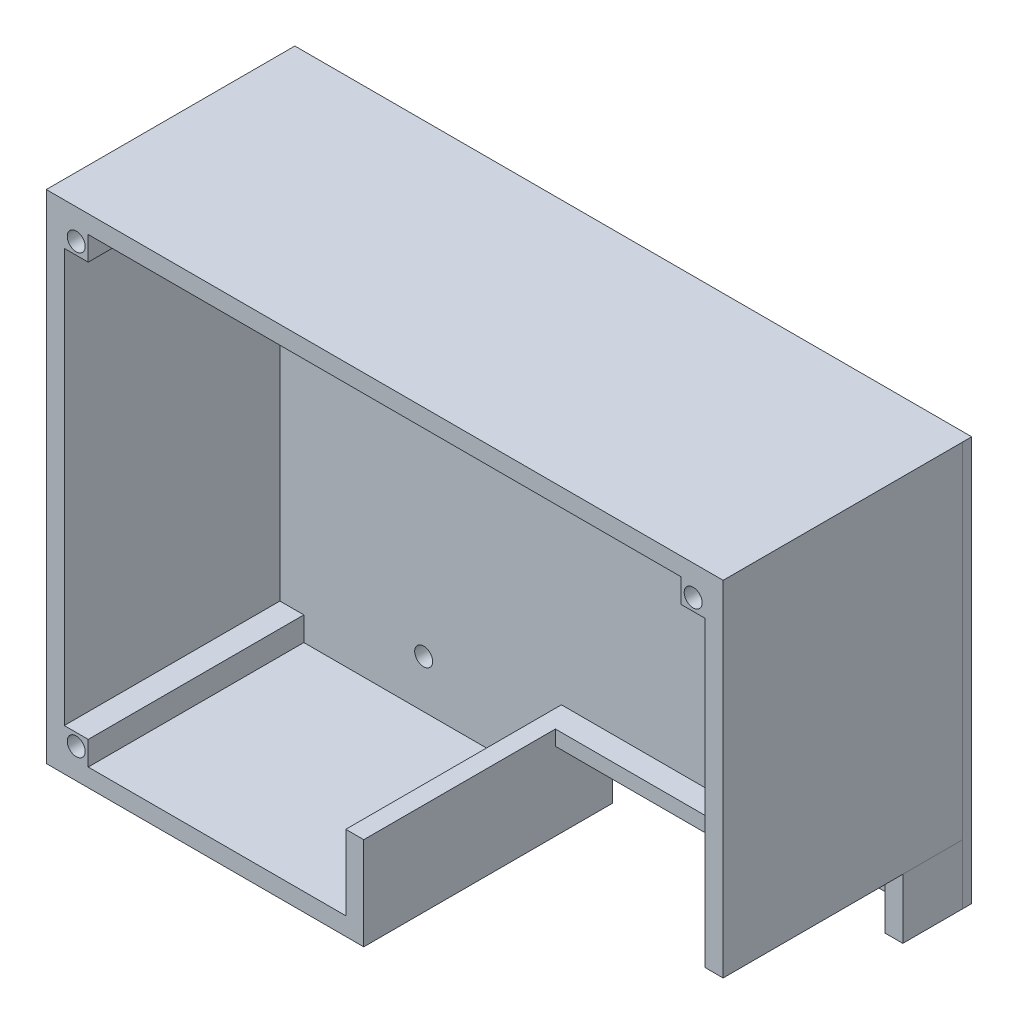
ISO-10303-21;
HEADER;
FILE_DESCRIPTION(('STEP AP214'),'2;1');
FILE_NAME('part.step','',(''),(''),'','','');
FILE_SCHEMA(('AUTOMOTIVE_DESIGN { 1 0 10303 214 1 1 1 1 }'));
ENDSEC;
DATA;
#1=APPLICATION_CONTEXT('core data for automotive mechanical design processes');
#2=APPLICATION_PROTOCOL_DEFINITION('international standard','automotive_design',2000,#1);
#3=PRODUCT_CONTEXT('',#1,'mechanical');
#4=PRODUCT('Part','Part','',(#3));
#5=PRODUCT_RELATED_PRODUCT_CATEGORY('part','',(#4));
#6=PRODUCT_DEFINITION_FORMATION('','',#4);
#7=PRODUCT_DEFINITION_CONTEXT('part definition',#1,'design');
#8=PRODUCT_DEFINITION('design','',#6,#7);
#9=PRODUCT_DEFINITION_SHAPE('','',#8);
#10=(LENGTH_UNIT() NAMED_UNIT(*) SI_UNIT(.MILLI.,.METRE.));
#11=(NAMED_UNIT(*) PLANE_ANGLE_UNIT() SI_UNIT($,.RADIAN.));
#12=(NAMED_UNIT(*) SI_UNIT($,.STERADIAN.) SOLID_ANGLE_UNIT());
#13=UNCERTAINTY_MEASURE_WITH_UNIT(LENGTH_MEASURE(1.E-05),#10,'distance_accuracy_value','');
#14=(GEOMETRIC_REPRESENTATION_CONTEXT(3) GLOBAL_UNCERTAINTY_ASSIGNED_CONTEXT((#13)) GLOBAL_UNIT_ASSIGNED_CONTEXT((#10,
#11,#12)) REPRESENTATION_CONTEXT('',''));
#15=CARTESIAN_POINT('',(0.,0.,0.));
#16=DIRECTION('',(0.,0.,1.));
#17=DIRECTION('',(1.,0.,0.));
#18=AXIS2_PLACEMENT_3D('',#15,#16,#17);
#19=CARTESIAN_POINT('',(27.,0.,4.));
#20=DIRECTION('',(0.,1.,0.));
#21=DIRECTION('',(-1.,0.,0.));
#22=AXIS2_PLACEMENT_3D('',#19,#20,#21);
#23=PLANE('',#22);
#24=DIRECTION('',(0.,0.,-1.));
#25=VECTOR('',#24,1.);
#26=CARTESIAN_POINT('',(85.6003249374755,0.,8.));
#27=LINE('',#26,#25);
#28=CARTESIAN_POINT('',(85.6003249374755,0.,4.));
#29=VERTEX_POINT('',#28);
#30=CARTESIAN_POINT('',(85.6003249374755,0.,-1.5));
#31=VERTEX_POINT('',#30);
#32=EDGE_CURVE('E323',#29,#31,#27,.T.);
#33=ORIENTED_EDGE('',*,*,#32,.T.);
#34=DIRECTION('',(-1.,0.,0.));
#35=VECTOR('',#34,1.);
#36=CARTESIAN_POINT('',(85.6003249374755,0.,-1.5));
#37=LINE('',#36,#35);
#38=CARTESIAN_POINT('',(107.994303538057,0.,-1.5));
#39=VERTEX_POINT('',#38);
#40=EDGE_CURVE('E236',#39,#31,#37,.T.);
#41=ORIENTED_EDGE('',*,*,#40,.F.);
#42=DIRECTION('',(0.,0.,1.));
#43=VECTOR('',#42,1.);
#44=CARTESIAN_POINT('',(107.994303538057,0.,-1.5));
#45=LINE('',#44,#43);
#46=CARTESIAN_POINT('',(107.994303538057,0.,0.));
#47=VERTEX_POINT('',#46);
#48=EDGE_CURVE('E248',#39,#47,#45,.T.);
#49=ORIENTED_EDGE('',*,*,#48,.T.);
#50=DIRECTION('',(0.,0.,-1.));
#51=VECTOR('',#50,1.);
#52=CARTESIAN_POINT('',(107.994303538057,0.,10.));
#53=LINE('',#52,#51);
#54=CARTESIAN_POINT('',(107.994303538057,0.,10.));
#55=VERTEX_POINT('',#54);
#56=EDGE_CURVE('E289',#55,#47,#53,.T.);
#57=ORIENTED_EDGE('',*,*,#56,.F.);
#58=DIRECTION('',(1.,0.,0.));
#59=VECTOR('',#58,1.);
#60=CARTESIAN_POINT('',(105.,0.,10.));
#61=LINE('',#60,#59);
#62=CARTESIAN_POINT('',(105.,0.,10.));
#63=VERTEX_POINT('',#62);
#64=EDGE_CURVE('E297',#63,#55,#61,.T.);
#65=ORIENTED_EDGE('',*,*,#64,.F.);
#66=DIRECTION('',(0.,0.,-1.));
#67=VECTOR('',#66,1.);
#68=CARTESIAN_POINT('',(105.,0.,10.));
#69=LINE('',#68,#67);
#70=CARTESIAN_POINT('',(105.,0.,4.));
#71=VERTEX_POINT('',#70);
#72=EDGE_CURVE('E296',#63,#71,#69,.T.);
#73=ORIENTED_EDGE('',*,*,#72,.T.);
#74=DIRECTION('',(1.,0.,0.));
#75=VECTOR('',#74,1.);
#76=CARTESIAN_POINT('',(27.,0.,4.));
#77=LINE('',#76,#75);
#78=EDGE_CURVE('E47',#29,#71,#77,.T.);
#79=ORIENTED_EDGE('',*,*,#78,.F.);
#80=EDGE_LOOP('',(#33,#41,#49,#57,#65,#73,#79));
#81=FACE_BOUND('',#80,.T.);
#82=ADVANCED_FACE('F39',(#81),#23,.F.);
#83=CARTESIAN_POINT('',(48.,-15.5,180.206989840022));
#84=DIRECTION('',(-1.,0.,0.));
#85=DIRECTION('',(0.,0.,1.));
#86=AXIS2_PLACEMENT_3D('',#83,#84,#85);
#87=PLANE('',#86);
#88=DIRECTION('',(0.,0.,-1.));
#89=VECTOR('',#88,1.);
#90=CARTESIAN_POINT('',(48.,-2.49999999999999,8.));
#91=LINE('',#90,#89);
#92=CARTESIAN_POINT('',(48.,-2.5,8.00000000000001));
#93=VERTEX_POINT('',#92);
#94=CARTESIAN_POINT('',(48.,-2.5,-1.5));
#95=VERTEX_POINT('',#94);
#96=EDGE_CURVE('E61',#93,#95,#91,.T.);
#97=ORIENTED_EDGE('',*,*,#96,.F.);
#98=DIRECTION('',(0.,-1.,0.));
#99=VECTOR('',#98,1.);
#100=CARTESIAN_POINT('',(48.,0.,8.));
#101=LINE('',#100,#99);
#102=CARTESIAN_POINT('',(48.,0.,8.00000000000001));
#103=VERTEX_POINT('',#102);
#104=EDGE_CURVE('E316',#103,#93,#101,.T.);
#105=ORIENTED_EDGE('',*,*,#104,.F.);
#106=DIRECTION('',(0.,0.,-1.));
#107=VECTOR('',#106,1.);
#108=CARTESIAN_POINT('',(48.,0.,180.206989840022));
#109=LINE('',#108,#107);
#110=CARTESIAN_POINT('',(48.,0.,40.));
#111=VERTEX_POINT('',#110);
#112=EDGE_CURVE('E341',#111,#103,#109,.T.);
#113=ORIENTED_EDGE('',*,*,#112,.F.);
#114=DIRECTION('',(0.,1.,0.));
#115=VECTOR('',#114,1.);
#116=CARTESIAN_POINT('',(48.,-15.5,40.));
#117=LINE('',#116,#115);
#118=CARTESIAN_POINT('',(48.,-15.5,40.));
#119=VERTEX_POINT('',#118);
#120=EDGE_CURVE('E328',#119,#111,#117,.T.);
#121=ORIENTED_EDGE('',*,*,#120,.F.);
#122=DIRECTION('',(0.,0.,-1.));
#123=VECTOR('',#122,1.);
#124=CARTESIAN_POINT('',(48.,-15.5,180.206989840022));
#125=LINE('',#124,#123);
#126=CARTESIAN_POINT('',(48.,-15.5,-1.5));
#127=VERTEX_POINT('',#126);
#128=EDGE_CURVE('E345',#119,#127,#125,.T.);
#129=ORIENTED_EDGE('',*,*,#128,.T.);
#130=DIRECTION('',(0.,-1.,0.));
#131=VECTOR('',#130,1.);
#132=CARTESIAN_POINT('',(48.,-15.5,-1.5));
#133=LINE('',#132,#131);
#134=EDGE_CURVE('E245',#95,#127,#133,.T.);
#135=ORIENTED_EDGE('',*,*,#134,.F.);
#136=EDGE_LOOP('',(#97,#105,#113,#121,#129,#135));
#137=FACE_BOUND('',#136,.T.);
#138=ADVANCED_FACE('F550',(#137),#87,.F.);
#139=CARTESIAN_POINT('',(105.,10.,40.));
#140=DIRECTION('',(1.,0.,0.));
#141=DIRECTION('',(0.,0.,-1.));
#142=AXIS2_PLACEMENT_3D('',#139,#140,#141);
#143=PLANE('',#142);
#144=DIRECTION('',(0.,0.,-1.));
#145=VECTOR('',#144,1.);
#146=CARTESIAN_POINT('',(105.,60.5,45.6568542494926));
#147=LINE('',#146,#145);
#148=CARTESIAN_POINT('',(105.,60.5,40.));
#149=VERTEX_POINT('',#148);
#150=CARTESIAN_POINT('',(105.,60.5,4.));
#151=VERTEX_POINT('',#150);
#152=EDGE_CURVE('E418',#149,#151,#147,.T.);
#153=ORIENTED_EDGE('',*,*,#152,.T.);
#154=DIRECTION('',(0.,1.,0.));
#155=VECTOR('',#154,1.);
#156=CARTESIAN_POINT('',(105.,0.,4.));
#157=LINE('',#156,#155);
#158=EDGE_CURVE('E449',#71,#151,#157,.T.);
#159=ORIENTED_EDGE('',*,*,#158,.F.);
#160=ORIENTED_EDGE('',*,*,#72,.F.);
#161=DIRECTION('',(0.,-1.,0.));
#162=VECTOR('',#161,1.);
#163=CARTESIAN_POINT('',(105.,10.,10.));
#164=LINE('',#163,#162);
#165=CARTESIAN_POINT('',(105.,10.,10.));
#166=VERTEX_POINT('',#165);
#167=EDGE_CURVE('E303',#166,#63,#164,.T.);
#168=ORIENTED_EDGE('',*,*,#167,.F.);
#169=DIRECTION('',(0.,0.,-1.));
#170=VECTOR('',#169,1.);
#171=CARTESIAN_POINT('',(105.,10.,40.));
#172=LINE('',#171,#170);
#173=CARTESIAN_POINT('',(105.,10.,40.));
#174=VERTEX_POINT('',#173);
#175=EDGE_CURVE('E446',#174,#166,#172,.T.);
#176=ORIENTED_EDGE('',*,*,#175,.F.);
#177=DIRECTION('',(0.,-1.,0.));
#178=VECTOR('',#177,1.);
#179=CARTESIAN_POINT('',(105.,10.,40.));
#180=LINE('',#179,#178);
#181=EDGE_CURVE('E442',#149,#174,#180,.T.);
#182=ORIENTED_EDGE('',*,*,#181,.F.);
#183=EDGE_LOOP('',(#153,#159,#160,#168,#176,#182));
#184=FACE_BOUND('',#183,.T.);
#185=ADVANCED_FACE('F546',(#184),#143,.F.);
#186=CARTESIAN_POINT('',(-2.,-12.5,40.));
#187=DIRECTION('',(0.,-1.,0.));
#188=DIRECTION('',(1.,0.,0.));
#189=AXIS2_PLACEMENT_3D('',#186,#187,#188);
#190=PLANE('',#189);
#191=DIRECTION('',(0.,0.,-1.));
#192=VECTOR('',#191,1.);
#193=CARTESIAN_POINT('',(1.99999999999998,-12.5,45.6568542494926));
#194=LINE('',#193,#192);
#195=CARTESIAN_POINT('',(1.99999999999998,-12.5,40.));
#196=VERTEX_POINT('',#195);
#197=CARTESIAN_POINT('',(1.99999999999998,-12.5,4.));
#198=VERTEX_POINT('',#197);
#199=EDGE_CURVE('E378',#196,#198,#194,.T.);
#200=ORIENTED_EDGE('',*,*,#199,.F.);
#201=DIRECTION('',(-1.,0.,0.));
#202=VECTOR('',#201,1.);
#203=CARTESIAN_POINT('',(-2.,-12.5,40.));
#204=LINE('',#203,#202);
#205=CARTESIAN_POINT('',(45.,-12.5,40.));
#206=VERTEX_POINT('',#205);
#207=EDGE_CURVE('E385',#206,#196,#204,.T.);
#208=ORIENTED_EDGE('',*,*,#207,.F.);
#209=DIRECTION('',(0.,0.,-1.));
#210=VECTOR('',#209,1.);
#211=CARTESIAN_POINT('',(45.,-12.5,53.6473440639562));
#212=LINE('',#211,#210);
#213=CARTESIAN_POINT('',(45.,-12.5,4.));
#214=VERTEX_POINT('',#213);
#215=EDGE_CURVE('E331',#206,#214,#212,.T.);
#216=ORIENTED_EDGE('',*,*,#215,.T.);
#217=DIRECTION('',(1.,0.,0.));
#218=VECTOR('',#217,1.);
#219=CARTESIAN_POINT('',(-2.,-12.5,4.));
#220=LINE('',#219,#218);
#221=EDGE_CURVE('E457',#198,#214,#220,.T.);
#222=ORIENTED_EDGE('',*,*,#221,.F.);
#223=EDGE_LOOP('',(#200,#208,#216,#222));
#224=FACE_BOUND('',#223,.T.);
#225=ADVANCED_FACE('F549',(#224),#190,.F.);
#226=CARTESIAN_POINT('',(105.,64.5,40.));
#227=DIRECTION('',(0.,1.,0.));
#228=DIRECTION('',(-1.,0.,0.));
#229=AXIS2_PLACEMENT_3D('',#226,#227,#228);
#230=PLANE('',#229);
#231=DIRECTION('',(0.,0.,-1.));
#232=VECTOR('',#231,1.);
#233=CARTESIAN_POINT('',(2.,64.5,45.6568542494926));
#234=LINE('',#233,#232);
#235=CARTESIAN_POINT('',(2.,64.5,40.));
#236=VERTEX_POINT('',#235);
#237=CARTESIAN_POINT('',(2.,64.5,4.));
#238=VERTEX_POINT('',#237);
#239=EDGE_CURVE('E392',#236,#238,#234,.T.);
#240=ORIENTED_EDGE('',*,*,#239,.T.);
#241=DIRECTION('',(-1.,0.,0.));
#242=VECTOR('',#241,1.);
#243=CARTESIAN_POINT('',(105.,64.5,4.));
#244=LINE('',#243,#242);
#245=CARTESIAN_POINT('',(101.,64.5,4.));
#246=VERTEX_POINT('',#245);
#247=EDGE_CURVE('E451',#246,#238,#244,.T.);
#248=ORIENTED_EDGE('',*,*,#247,.F.);
#249=DIRECTION('',(0.,0.,-1.));
#250=VECTOR('',#249,1.);
#251=CARTESIAN_POINT('',(101.,64.5,45.6568542494926));
#252=LINE('',#251,#250);
#253=CARTESIAN_POINT('',(101.,64.5,40.));
#254=VERTEX_POINT('',#253);
#255=EDGE_CURVE('E363',#254,#246,#252,.T.);
#256=ORIENTED_EDGE('',*,*,#255,.F.);
#257=DIRECTION('',(1.,0.,0.));
#258=VECTOR('',#257,1.);
#259=CARTESIAN_POINT('',(105.,64.5,40.));
#260=LINE('',#259,#258);
#261=EDGE_CURVE('E439',#236,#254,#260,.T.);
#262=ORIENTED_EDGE('',*,*,#261,.F.);
#263=EDGE_LOOP('',(#240,#248,#256,#262));
#264=FACE_BOUND('',#263,.T.);
#265=ADVANCED_FACE('F552',(#264),#230,.F.);
#266=CARTESIAN_POINT('',(-2.,64.5,40.));
#267=DIRECTION('',(-1.,0.,0.));
#268=DIRECTION('',(0.,-1.,0.));
#269=AXIS2_PLACEMENT_3D('',#266,#267,#268);
#270=PLANE('',#269);
#271=DIRECTION('',(0.,0.,-1.));
#272=VECTOR('',#271,1.);
#273=CARTESIAN_POINT('',(-2.,-8.50000000000002,45.6568542494926));
#274=LINE('',#273,#272);
#275=CARTESIAN_POINT('',(-2.,-8.50000000000002,40.));
#276=VERTEX_POINT('',#275);
#277=CARTESIAN_POINT('',(-2.,-8.50000000000002,4.));
#278=VERTEX_POINT('',#277);
#279=EDGE_CURVE('E380',#276,#278,#274,.T.);
#280=ORIENTED_EDGE('',*,*,#279,.T.);
#281=DIRECTION('',(0.,-1.,0.));
#282=VECTOR('',#281,1.);
#283=CARTESIAN_POINT('',(-2.,64.5,4.));
#284=LINE('',#283,#282);
#285=CARTESIAN_POINT('',(-2.,60.5,4.));
#286=VERTEX_POINT('',#285);
#287=EDGE_CURVE('E454',#286,#278,#284,.T.);
#288=ORIENTED_EDGE('',*,*,#287,.F.);
#289=DIRECTION('',(0.,0.,-1.));
#290=VECTOR('',#289,1.);
#291=CARTESIAN_POINT('',(-2.,60.5,45.6568542494926));
#292=LINE('',#291,#290);
#293=CARTESIAN_POINT('',(-2.,60.5,40.));
#294=VERTEX_POINT('',#293);
#295=EDGE_CURVE('E395',#294,#286,#292,.T.);
#296=ORIENTED_EDGE('',*,*,#295,.F.);
#297=DIRECTION('',(0.,1.,0.));
#298=VECTOR('',#297,1.);
#299=CARTESIAN_POINT('',(-2.,64.5,40.));
#300=LINE('',#299,#298);
#301=EDGE_CURVE('E436',#276,#294,#300,.T.);
#302=ORIENTED_EDGE('',*,*,#301,.F.);
#303=EDGE_LOOP('',(#280,#288,#296,#302));
#304=FACE_BOUND('',#303,.T.);
#305=ADVANCED_FACE('F555',(#304),#270,.F.);
#306=CARTESIAN_POINT('',(22.,-4.5,4.));
#307=DIRECTION('',(0.,0.,-1.));
#308=DIRECTION('',(-1.,0.,0.));
#309=AXIS2_PLACEMENT_3D('',#306,#307,#308);
#310=PLANE('',#309);
#311=DIRECTION('',(0.,-1.,0.));
#312=VECTOR('',#311,1.);
#313=CARTESIAN_POINT('',(45.,-12.5,4.));
#314=LINE('',#313,#312);
#315=CARTESIAN_POINT('',(45.,0.,4.));
#316=VERTEX_POINT('',#315);
#317=EDGE_CURVE('E352',#316,#214,#314,.T.);
#318=ORIENTED_EDGE('',*,*,#317,.F.);
#319=EDGE_CURVE('E11',#316,#29,#77,.T.);
#320=ORIENTED_EDGE('',*,*,#319,.T.);
#321=ORIENTED_EDGE('',*,*,#78,.T.);
#322=ORIENTED_EDGE('',*,*,#158,.T.);
#323=DIRECTION('',(1.,0.,0.));
#324=VECTOR('',#323,1.);
#325=CARTESIAN_POINT('',(101.,60.5,4.));
#326=LINE('',#325,#324);
#327=CARTESIAN_POINT('',(101.,60.5,4.));
#328=VERTEX_POINT('',#327);
#329=EDGE_CURVE('E421',#328,#151,#326,.T.);
#330=ORIENTED_EDGE('',*,*,#329,.F.);
#331=DIRECTION('',(0.,-1.,0.));
#332=VECTOR('',#331,1.);
#333=CARTESIAN_POINT('',(101.,60.5,4.));
#334=LINE('',#333,#332);
#335=EDGE_CURVE('E424',#246,#328,#334,.T.);
#336=ORIENTED_EDGE('',*,*,#335,.F.);
#337=ORIENTED_EDGE('',*,*,#247,.T.);
#338=DIRECTION('',(0.,1.,0.));
#339=VECTOR('',#338,1.);
#340=CARTESIAN_POINT('',(2.,64.5,4.));
#341=LINE('',#340,#339);
#342=CARTESIAN_POINT('',(2.,60.5,4.));
#343=VERTEX_POINT('',#342);
#344=EDGE_CURVE('E403',#343,#238,#341,.T.);
#345=ORIENTED_EDGE('',*,*,#344,.F.);
#346=DIRECTION('',(1.,0.,0.));
#347=VECTOR('',#346,1.);
#348=CARTESIAN_POINT('',(-2.,60.5,4.));
#349=LINE('',#348,#347);
#350=EDGE_CURVE('E400',#286,#343,#349,.T.);
#351=ORIENTED_EDGE('',*,*,#350,.F.);
#352=ORIENTED_EDGE('',*,*,#287,.T.);
#353=DIRECTION('',(-1.,0.,0.));
#354=VECTOR('',#353,1.);
#355=CARTESIAN_POINT('',(-2.,-8.50000000000002,4.));
#356=LINE('',#355,#354);
#357=CARTESIAN_POINT('',(1.99999999999998,-8.50000000000002,4.));
#358=VERTEX_POINT('',#357);
#359=EDGE_CURVE('E376',#358,#278,#356,.T.);
#360=ORIENTED_EDGE('',*,*,#359,.F.);
#361=DIRECTION('',(0.,1.,0.));
#362=VECTOR('',#361,1.);
#363=CARTESIAN_POINT('',(1.99999999999998,-8.50000000000002,4.));
#364=LINE('',#363,#362);
#365=EDGE_CURVE('E373',#198,#358,#364,.T.);
#366=ORIENTED_EDGE('',*,*,#365,.F.);
#367=ORIENTED_EDGE('',*,*,#221,.T.);
#368=EDGE_LOOP('',(#318,#320,#321,#322,#330,#336,#337,#345,#351,#352,#360,#366,#367));
#369=FACE_BOUND('',#368,.T.);
#370=CARTESIAN_POINT('',(22.,-4.5,4.));
#371=DIRECTION('',(0.,0.,1.));
#372=DIRECTION('',(1.,0.,0.));
#373=AXIS2_PLACEMENT_3D('',#370,#371,#372);
#374=CIRCLE('',#373,1.5);
#375=CARTESIAN_POINT('',(23.5,-4.5,4.));
#376=VERTEX_POINT('',#375);
#377=EDGE_CURVE('E466',#376,#376,#374,.T.);
#378=ORIENTED_EDGE('',*,*,#377,.F.);
#379=EDGE_LOOP('',(#378));
#380=FACE_BOUND('',#379,.T.);
#381=CARTESIAN_POINT('',(22.,56.5,4.));
#382=DIRECTION('',(0.,0.,1.));
#383=DIRECTION('',(-1.,0.,0.));
#384=AXIS2_PLACEMENT_3D('',#381,#382,#383);
#385=CIRCLE('',#384,1.5);
#386=CARTESIAN_POINT('',(20.5,56.5,4.));
#387=VERTEX_POINT('',#386);
#388=EDGE_CURVE('E460',#387,#387,#385,.T.);
#389=ORIENTED_EDGE('',*,*,#388,.F.);
#390=EDGE_LOOP('',(#389));
#391=FACE_BOUND('',#390,.T.);
#392=ADVANCED_FACE('F559',(#369,#380,#391),#310,.F.);
#393=CARTESIAN_POINT('',(22.,-4.5,4.));
#394=DIRECTION('',(0.,0.,-1.));
#395=DIRECTION('',(-1.,0.,0.));
#396=AXIS2_PLACEMENT_3D('',#393,#394,#395);
#397=CYLINDRICAL_SURFACE('',#396,1.5);
#398=ORIENTED_EDGE('',*,*,#377,.T.);
#399=EDGE_LOOP('',(#398));
#400=FACE_BOUND('',#399,.T.);
#401=CARTESIAN_POINT('',(22.,-4.5,0.));
#402=DIRECTION('',(0.,0.,1.));
#403=DIRECTION('',(1.,0.,0.));
#404=AXIS2_PLACEMENT_3D('',#401,#402,#403);
#405=CIRCLE('',#404,1.5);
#406=CARTESIAN_POINT('',(23.5,-4.5,0.));
#407=VERTEX_POINT('',#406);
#408=EDGE_CURVE('E463',#407,#407,#405,.T.);
#409=ORIENTED_EDGE('',*,*,#408,.F.);
#410=EDGE_LOOP('',(#409));
#411=FACE_BOUND('',#410,.T.);
#412=ADVANCED_FACE('F566',(#400,#411),#397,.F.);
#413=CARTESIAN_POINT('',(22.,56.5,4.));
#414=DIRECTION('',(0.,0.,-1.));
#415=DIRECTION('',(-1.,0.,0.));
#416=AXIS2_PLACEMENT_3D('',#413,#414,#415);
#417=CYLINDRICAL_SURFACE('',#416,1.5);
#418=ORIENTED_EDGE('',*,*,#388,.T.);
#419=EDGE_LOOP('',(#418));
#420=FACE_BOUND('',#419,.T.);
#421=CARTESIAN_POINT('',(22.,56.5,0.));
#422=DIRECTION('',(0.,0.,1.));
#423=DIRECTION('',(-1.,0.,0.));
#424=AXIS2_PLACEMENT_3D('',#421,#422,#423);
#425=CIRCLE('',#424,1.5);
#426=CARTESIAN_POINT('',(20.5,56.5,0.));
#427=VERTEX_POINT('',#426);
#428=EDGE_CURVE('E459',#427,#427,#425,.T.);
#429=ORIENTED_EDGE('',*,*,#428,.F.);
#430=EDGE_LOOP('',(#429));
#431=FACE_BOUND('',#430,.T.);
#432=ADVANCED_FACE('F544',(#420,#431),#417,.F.);
#433=CARTESIAN_POINT('',(106.,10.,40.));
#434=DIRECTION('',(0.,1.,0.));
#435=DIRECTION('',(0.,0.,1.));
#436=AXIS2_PLACEMENT_3D('',#433,#434,#435);
#437=PLANE('',#436);
#438=ORIENTED_EDGE('',*,*,#175,.T.);
#439=DIRECTION('',(-1.,0.,0.));
#440=VECTOR('',#439,1.);
#441=CARTESIAN_POINT('',(108.,10.,10.));
#442=LINE('',#441,#440);
#443=CARTESIAN_POINT('',(108.,10.,10.));
#444=VERTEX_POINT('',#443);
#445=EDGE_CURVE('E306',#444,#166,#442,.T.);
#446=ORIENTED_EDGE('',*,*,#445,.F.);
#447=DIRECTION('',(0.,0.,-1.));
#448=VECTOR('',#447,1.);
#449=CARTESIAN_POINT('',(108.,10.,180.206989840022));
#450=LINE('',#449,#448);
#451=CARTESIAN_POINT('',(108.,10.,40.));
#452=VERTEX_POINT('',#451);
#453=EDGE_CURVE('E327',#452,#444,#450,.T.);
#454=ORIENTED_EDGE('',*,*,#453,.F.);
#455=DIRECTION('',(1.,0.,0.));
#456=VECTOR('',#455,1.);
#457=CARTESIAN_POINT('',(106.,10.,40.));
#458=LINE('',#457,#456);
#459=EDGE_CURVE('E444',#174,#452,#458,.T.);
#460=ORIENTED_EDGE('',*,*,#459,.F.);
#461=EDGE_LOOP('',(#438,#446,#454,#460));
#462=FACE_BOUND('',#461,.T.);
#463=ADVANCED_FACE('F540',(#462),#437,.F.);
#464=CARTESIAN_POINT('',(0.,0.,40.));
#465=DIRECTION('',(0.,0.,1.));
#466=DIRECTION('',(1.,0.,0.));
#467=AXIS2_PLACEMENT_3D('',#464,#465,#466);
#468=PLANE('',#467);
#469=ORIENTED_EDGE('',*,*,#207,.T.);
#470=DIRECTION('',(0.,1.,0.));
#471=VECTOR('',#470,1.);
#472=CARTESIAN_POINT('',(1.99999999999998,-8.50000000000002,40.));
#473=LINE('',#472,#471);
#474=CARTESIAN_POINT('',(1.99999999999998,-8.50000000000002,40.));
#475=VERTEX_POINT('',#474);
#476=EDGE_CURVE('E366',#196,#475,#473,.T.);
#477=ORIENTED_EDGE('',*,*,#476,.T.);
#478=DIRECTION('',(-1.,0.,0.));
#479=VECTOR('',#478,1.);
#480=CARTESIAN_POINT('',(-2.,-8.50000000000002,40.));
#481=LINE('',#480,#479);
#482=EDGE_CURVE('E364',#475,#276,#481,.T.);
#483=ORIENTED_EDGE('',*,*,#482,.T.);
#484=ORIENTED_EDGE('',*,*,#301,.T.);
#485=DIRECTION('',(1.,0.,0.));
#486=VECTOR('',#485,1.);
#487=CARTESIAN_POINT('',(-2.,60.5,40.));
#488=LINE('',#487,#486);
#489=CARTESIAN_POINT('',(2.,60.5,40.));
#490=VERTEX_POINT('',#489);
#491=EDGE_CURVE('E391',#294,#490,#488,.T.);
#492=ORIENTED_EDGE('',*,*,#491,.T.);
#493=DIRECTION('',(0.,1.,0.));
#494=VECTOR('',#493,1.);
#495=CARTESIAN_POINT('',(2.,64.5,40.));
#496=LINE('',#495,#494);
#497=EDGE_CURVE('E408',#490,#236,#496,.T.);
#498=ORIENTED_EDGE('',*,*,#497,.T.);
#499=ORIENTED_EDGE('',*,*,#261,.T.);
#500=DIRECTION('',(0.,-1.,0.));
#501=VECTOR('',#500,1.);
#502=CARTESIAN_POINT('',(101.,60.5,40.));
#503=LINE('',#502,#501);
#504=CARTESIAN_POINT('',(101.,60.5,40.));
#505=VERTEX_POINT('',#504);
#506=EDGE_CURVE('E430',#254,#505,#503,.T.);
#507=ORIENTED_EDGE('',*,*,#506,.T.);
#508=DIRECTION('',(1.,0.,0.));
#509=VECTOR('',#508,1.);
#510=CARTESIAN_POINT('',(101.,60.5,40.));
#511=LINE('',#510,#509);
#512=EDGE_CURVE('E414',#505,#149,#511,.T.);
#513=ORIENTED_EDGE('',*,*,#512,.T.);
#514=ORIENTED_EDGE('',*,*,#181,.T.);
#515=ORIENTED_EDGE('',*,*,#459,.T.);
#516=DIRECTION('',(0.,1.,0.));
#517=VECTOR('',#516,1.);
#518=CARTESIAN_POINT('',(108.,10.,40.));
#519=LINE('',#518,#517);
#520=CARTESIAN_POINT('',(108.,67.5,40.));
#521=VERTEX_POINT('',#520);
#522=EDGE_CURVE('E338',#452,#521,#519,.T.);
#523=ORIENTED_EDGE('',*,*,#522,.T.);
#524=DIRECTION('',(-1.,0.,0.));
#525=VECTOR('',#524,1.);
#526=CARTESIAN_POINT('',(108.,67.5,40.));
#527=LINE('',#526,#525);
#528=CARTESIAN_POINT('',(-5.,67.5,40.));
#529=VERTEX_POINT('',#528);
#530=EDGE_CURVE('E336',#521,#529,#527,.T.);
#531=ORIENTED_EDGE('',*,*,#530,.T.);
#532=DIRECTION('',(0.,-1.,0.));
#533=VECTOR('',#532,1.);
#534=CARTESIAN_POINT('',(-5.,67.5,40.));
#535=LINE('',#534,#533);
#536=CARTESIAN_POINT('',(-5.,-15.5,40.));
#537=VERTEX_POINT('',#536);
#538=EDGE_CURVE('E213',#529,#537,#535,.T.);
#539=ORIENTED_EDGE('',*,*,#538,.T.);
#540=DIRECTION('',(1.,0.,0.));
#541=VECTOR('',#540,1.);
#542=CARTESIAN_POINT('',(-5.,-15.5,40.));
#543=LINE('',#542,#541);
#544=EDGE_CURVE('E332',#537,#119,#543,.T.);
#545=ORIENTED_EDGE('',*,*,#544,.T.);
#546=ORIENTED_EDGE('',*,*,#120,.T.);
#547=DIRECTION('',(-1.,0.,0.));
#548=VECTOR('',#547,1.);
#549=CARTESIAN_POINT('',(46.,0.,40.));
#550=LINE('',#549,#548);
#551=CARTESIAN_POINT('',(45.,0.,40.));
#552=VERTEX_POINT('',#551);
#553=EDGE_CURVE('E349',#111,#552,#550,.T.);
#554=ORIENTED_EDGE('',*,*,#553,.T.);
#555=DIRECTION('',(0.,-1.,0.));
#556=VECTOR('',#555,1.);
#557=CARTESIAN_POINT('',(45.,0.,40.));
#558=LINE('',#557,#556);
#559=EDGE_CURVE('E353',#552,#206,#558,.T.);
#560=ORIENTED_EDGE('',*,*,#559,.T.);
#561=EDGE_LOOP('',(#469,#477,#483,#484,#492,#498,#499,#507,#513,#514,#515,#523,#531,#539,#545,
#546,#554,#560));
#562=FACE_BOUND('',#561,.T.);
#563=CARTESIAN_POINT('',(103.,62.5,40.));
#564=DIRECTION('',(0.,0.,1.));
#565=DIRECTION('',(1.,0.,0.));
#566=AXIS2_PLACEMENT_3D('',#563,#564,#565);
#567=CIRCLE('',#566,1.5);
#568=CARTESIAN_POINT('',(104.5,62.5,40.));
#569=VERTEX_POINT('',#568);
#570=EDGE_CURVE('E396',#569,#569,#567,.T.);
#571=ORIENTED_EDGE('',*,*,#570,.F.);
#572=EDGE_LOOP('',(#571));
#573=FACE_BOUND('',#572,.T.);
#574=CARTESIAN_POINT('',(0.,62.5,40.));
#575=DIRECTION('',(0.,0.,1.));
#576=DIRECTION('',(1.,0.,0.));
#577=AXIS2_PLACEMENT_3D('',#574,#575,#576);
#578=CIRCLE('',#577,1.5);
#579=CARTESIAN_POINT('',(1.5,62.5,40.));
#580=VERTEX_POINT('',#579);
#581=EDGE_CURVE('E388',#580,#580,#578,.T.);
#582=ORIENTED_EDGE('',*,*,#581,.F.);
#583=EDGE_LOOP('',(#582));
#584=FACE_BOUND('',#583,.T.);
#585=CARTESIAN_POINT('',(0.,-10.5,40.));
#586=DIRECTION('',(0.,0.,1.));
#587=DIRECTION('',(1.,0.,0.));
#588=AXIS2_PLACEMENT_3D('',#585,#586,#587);
#589=CIRCLE('',#588,1.5);
#590=CARTESIAN_POINT('',(1.5,-10.5,40.));
#591=VERTEX_POINT('',#590);
#592=EDGE_CURVE('E367',#591,#591,#589,.T.);
#593=ORIENTED_EDGE('',*,*,#592,.F.);
#594=EDGE_LOOP('',(#593));
#595=FACE_BOUND('',#594,.T.);
#596=ADVANCED_FACE('F533',(#562,#573,#584,#595),#468,.T.);
#597=CARTESIAN_POINT('',(101.,60.5,45.6568542494926));
#598=DIRECTION('',(0.,1.,0.));
#599=DIRECTION('',(0.,0.,1.));
#600=AXIS2_PLACEMENT_3D('',#597,#598,#599);
#601=PLANE('',#600);
#602=ORIENTED_EDGE('',*,*,#512,.F.);
#603=DIRECTION('',(0.,0.,-1.));
#604=VECTOR('',#603,1.);
#605=CARTESIAN_POINT('',(101.,60.5,45.6568542494926));
#606=LINE('',#605,#604);
#607=EDGE_CURVE('E416',#505,#328,#606,.T.);
#608=ORIENTED_EDGE('',*,*,#607,.T.);
#609=ORIENTED_EDGE('',*,*,#329,.T.);
#610=ORIENTED_EDGE('',*,*,#152,.F.);
#611=EDGE_LOOP('',(#602,#608,#609,#610));
#612=FACE_BOUND('',#611,.T.);
#613=ADVANCED_FACE('F529',(#612),#601,.F.);
#614=CARTESIAN_POINT('',(101.,60.5,45.6568542494926));
#615=DIRECTION('',(1.,0.,0.));
#616=DIRECTION('',(0.,0.,-1.));
#617=AXIS2_PLACEMENT_3D('',#614,#615,#616);
#618=PLANE('',#617);
#619=ORIENTED_EDGE('',*,*,#506,.F.);
#620=ORIENTED_EDGE('',*,*,#255,.T.);
#621=ORIENTED_EDGE('',*,*,#335,.T.);
#622=ORIENTED_EDGE('',*,*,#607,.F.);
#623=EDGE_LOOP('',(#619,#620,#621,#622));
#624=FACE_BOUND('',#623,.T.);
#625=ADVANCED_FACE('F526',(#624),#618,.F.);
#626=CARTESIAN_POINT('',(103.,62.5,45.6568542494926));
#627=DIRECTION('',(0.,0.,-1.));
#628=DIRECTION('',(-1.,0.,0.));
#629=AXIS2_PLACEMENT_3D('',#626,#627,#628);
#630=CYLINDRICAL_SURFACE('',#629,1.5);
#631=CARTESIAN_POINT('',(103.,62.5,4.));
#632=DIRECTION('',(0.,0.,1.));
#633=DIRECTION('',(1.,0.,0.));
#634=AXIS2_PLACEMENT_3D('',#631,#632,#633);
#635=CIRCLE('',#634,1.5);
#636=CARTESIAN_POINT('',(104.5,62.5,4.));
#637=VERTEX_POINT('',#636);
#638=EDGE_CURVE('E427',#637,#637,#635,.T.);
#639=ORIENTED_EDGE('',*,*,#638,.F.);
#640=EDGE_LOOP('',(#639));
#641=FACE_BOUND('',#640,.T.);
#642=ORIENTED_EDGE('',*,*,#570,.T.);
#643=EDGE_LOOP('',(#642));
#644=FACE_BOUND('',#643,.T.);
#645=ADVANCED_FACE('F521',(#641,#644),#630,.F.);
#646=CARTESIAN_POINT('',(-2.,60.5,45.6568542494926));
#647=DIRECTION('',(0.,1.,0.));
#648=DIRECTION('',(0.,0.,1.));
#649=AXIS2_PLACEMENT_3D('',#646,#647,#648);
#650=PLANE('',#649);
#651=ORIENTED_EDGE('',*,*,#491,.F.);
#652=ORIENTED_EDGE('',*,*,#295,.T.);
#653=ORIENTED_EDGE('',*,*,#350,.T.);
#654=DIRECTION('',(0.,0.,-1.));
#655=VECTOR('',#654,1.);
#656=CARTESIAN_POINT('',(2.,60.5,45.6568542494926));
#657=LINE('',#656,#655);
#658=EDGE_CURVE('E398',#490,#343,#657,.T.);
#659=ORIENTED_EDGE('',*,*,#658,.F.);
#660=EDGE_LOOP('',(#651,#652,#653,#659));
#661=FACE_BOUND('',#660,.T.);
#662=ADVANCED_FACE('F517',(#661),#650,.F.);
#663=CARTESIAN_POINT('',(2.,64.5,45.6568542494926));
#664=DIRECTION('',(-1.,0.,0.));
#665=DIRECTION('',(0.,-1.,0.));
#666=AXIS2_PLACEMENT_3D('',#663,#664,#665);
#667=PLANE('',#666);
#668=ORIENTED_EDGE('',*,*,#497,.F.);
#669=ORIENTED_EDGE('',*,*,#658,.T.);
#670=ORIENTED_EDGE('',*,*,#344,.T.);
#671=ORIENTED_EDGE('',*,*,#239,.F.);
#672=EDGE_LOOP('',(#668,#669,#670,#671));
#673=FACE_BOUND('',#672,.T.);
#674=ADVANCED_FACE('F514',(#673),#667,.F.);
#675=CARTESIAN_POINT('',(0.,62.5,45.6568542494926));
#676=DIRECTION('',(0.,0.,-1.));
#677=DIRECTION('',(-1.,0.,0.));
#678=AXIS2_PLACEMENT_3D('',#675,#676,#677);
#679=CYLINDRICAL_SURFACE('',#678,1.5);
#680=CARTESIAN_POINT('',(0.,62.5,4.));
#681=DIRECTION('',(0.,0.,1.));
#682=DIRECTION('',(1.,0.,0.));
#683=AXIS2_PLACEMENT_3D('',#680,#681,#682);
#684=CIRCLE('',#683,1.5);
#685=CARTESIAN_POINT('',(1.5,62.5,4.));
#686=VERTEX_POINT('',#685);
#687=EDGE_CURVE('E405',#686,#686,#684,.T.);
#688=ORIENTED_EDGE('',*,*,#687,.F.);
#689=EDGE_LOOP('',(#688));
#690=FACE_BOUND('',#689,.T.);
#691=ORIENTED_EDGE('',*,*,#581,.T.);
#692=EDGE_LOOP('',(#691));
#693=FACE_BOUND('',#692,.T.);
#694=ADVANCED_FACE('F509',(#690,#693),#679,.F.);
#695=CARTESIAN_POINT('',(-2.,-8.50000000000002,45.6568542494926));
#696=DIRECTION('',(0.,-1.,0.));
#697=DIRECTION('',(0.,0.,-1.));
#698=AXIS2_PLACEMENT_3D('',#695,#696,#697);
#699=PLANE('',#698);
#700=ORIENTED_EDGE('',*,*,#482,.F.);
#701=DIRECTION('',(0.,0.,-1.));
#702=VECTOR('',#701,1.);
#703=CARTESIAN_POINT('',(1.99999999999998,-8.50000000000002,45.6568542494926));
#704=LINE('',#703,#702);
#705=EDGE_CURVE('E383',#475,#358,#704,.T.);
#706=ORIENTED_EDGE('',*,*,#705,.T.);
#707=ORIENTED_EDGE('',*,*,#359,.T.);
#708=ORIENTED_EDGE('',*,*,#279,.F.);
#709=EDGE_LOOP('',(#700,#706,#707,#708));
#710=FACE_BOUND('',#709,.T.);
#711=ADVANCED_FACE('F506',(#710),#699,.F.);
#712=CARTESIAN_POINT('',(1.99999999999998,-8.50000000000002,45.6568542494926));
#713=DIRECTION('',(-1.,0.,0.));
#714=DIRECTION('',(0.,-1.,0.));
#715=AXIS2_PLACEMENT_3D('',#712,#713,#714);
#716=PLANE('',#715);
#717=ORIENTED_EDGE('',*,*,#476,.F.);
#718=ORIENTED_EDGE('',*,*,#199,.T.);
#719=ORIENTED_EDGE('',*,*,#365,.T.);
#720=ORIENTED_EDGE('',*,*,#705,.F.);
#721=EDGE_LOOP('',(#717,#718,#719,#720));
#722=FACE_BOUND('',#721,.T.);
#723=ADVANCED_FACE('F504',(#722),#716,.F.);
#724=CARTESIAN_POINT('',(0.,-10.5,45.6568542494926));
#725=DIRECTION('',(0.,0.,-1.));
#726=DIRECTION('',(-1.,0.,0.));
#727=AXIS2_PLACEMENT_3D('',#724,#725,#726);
#728=CYLINDRICAL_SURFACE('',#727,1.5);
#729=CARTESIAN_POINT('',(0.,-10.5,4.));
#730=DIRECTION('',(0.,0.,1.));
#731=DIRECTION('',(1.,0.,0.));
#732=AXIS2_PLACEMENT_3D('',#729,#730,#731);
#733=CIRCLE('',#732,1.5);
#734=CARTESIAN_POINT('',(1.5,-10.5,4.));
#735=VERTEX_POINT('',#734);
#736=EDGE_CURVE('E370',#735,#735,#733,.T.);
#737=ORIENTED_EDGE('',*,*,#736,.F.);
#738=EDGE_LOOP('',(#737));
#739=FACE_BOUND('',#738,.T.);
#740=ORIENTED_EDGE('',*,*,#592,.T.);
#741=EDGE_LOOP('',(#740));
#742=FACE_BOUND('',#741,.T.);
#743=ADVANCED_FACE('F500',(#739,#742),#728,.F.);
#744=ORIENTED_EDGE('',*,*,#638,.T.);
#745=EDGE_LOOP('',(#744));
#746=FACE_BOUND('',#745,.T.);
#747=ADVANCED_FACE('F503',(#746),#310,.F.);
#748=ORIENTED_EDGE('',*,*,#687,.T.);
#749=EDGE_LOOP('',(#748));
#750=FACE_BOUND('',#749,.T.);
#751=ADVANCED_FACE('F575',(#750),#310,.F.);
#752=ORIENTED_EDGE('',*,*,#736,.T.);
#753=EDGE_LOOP('',(#752));
#754=FACE_BOUND('',#753,.T.);
#755=ADVANCED_FACE('F498',(#754),#310,.F.);
#756=CARTESIAN_POINT('',(46.,0.,53.6473440639562));
#757=DIRECTION('',(0.,-1.,0.));
#758=DIRECTION('',(1.,0.,0.));
#759=AXIS2_PLACEMENT_3D('',#756,#757,#758);
#760=PLANE('',#759);
#761=ORIENTED_EDGE('',*,*,#553,.F.);
#762=ORIENTED_EDGE('',*,*,#112,.T.);
#763=DIRECTION('',(-1.,0.,0.));
#764=VECTOR('',#763,1.);
#765=CARTESIAN_POINT('',(85.6003249374755,0.,8.));
#766=LINE('',#765,#764);
#767=CARTESIAN_POINT('',(85.6003249374755,0.,8.));
#768=VERTEX_POINT('',#767);
#769=EDGE_CURVE('E313',#768,#103,#766,.T.);
#770=ORIENTED_EDGE('',*,*,#769,.F.);
#771=EDGE_CURVE('E324',#768,#29,#27,.T.);
#772=ORIENTED_EDGE('',*,*,#771,.T.);
#773=ORIENTED_EDGE('',*,*,#319,.F.);
#774=DIRECTION('',(0.,0.,-1.));
#775=VECTOR('',#774,1.);
#776=CARTESIAN_POINT('',(45.,0.,53.6473440639562));
#777=LINE('',#776,#775);
#778=EDGE_CURVE('E356',#552,#316,#777,.T.);
#779=ORIENTED_EDGE('',*,*,#778,.F.);
#780=EDGE_LOOP('',(#761,#762,#770,#772,#773,#779));
#781=FACE_BOUND('',#780,.T.);
#782=ADVANCED_FACE('F494',(#781),#760,.F.);
#783=CARTESIAN_POINT('',(45.,0.,53.6473440639562));
#784=DIRECTION('',(1.,0.,0.));
#785=DIRECTION('',(0.,0.,-1.));
#786=AXIS2_PLACEMENT_3D('',#783,#784,#785);
#787=PLANE('',#786);
#788=ORIENTED_EDGE('',*,*,#778,.T.);
#789=ORIENTED_EDGE('',*,*,#317,.T.);
#790=ORIENTED_EDGE('',*,*,#215,.F.);
#791=ORIENTED_EDGE('',*,*,#559,.F.);
#792=EDGE_LOOP('',(#788,#789,#790,#791));
#793=FACE_BOUND('',#792,.T.);
#794=ADVANCED_FACE('F490',(#793),#787,.F.);
#795=CARTESIAN_POINT('',(108.,10.,180.206989840022));
#796=DIRECTION('',(-1.,0.,0.));
#797=DIRECTION('',(0.,0.,1.));
#798=AXIS2_PLACEMENT_3D('',#795,#796,#797);
#799=PLANE('',#798);
#800=ORIENTED_EDGE('',*,*,#522,.F.);
#801=ORIENTED_EDGE('',*,*,#453,.T.);
#802=DIRECTION('',(0.,0.,-1.));
#803=VECTOR('',#802,1.);
#804=CARTESIAN_POINT('',(108.,10.,10.));
#805=LINE('',#804,#803);
#806=CARTESIAN_POINT('',(107.99757372919,10.0000002047579,0.));
#807=VERTEX_POINT('',#806);
#808=EDGE_CURVE('E301',#444,#807,#805,.T.);
#809=ORIENTED_EDGE('',*,*,#808,.T.);
#810=CARTESIAN_POINT('',(108.,10.,0.));
#811=DIRECTION('',(0.,1.,0.));
#812=VECTOR('',#811,1.);
#813=LINE('',#810,#812);
#814=CARTESIAN_POINT('',(108.,67.5,0.));
#815=VERTEX_POINT('',#814);
#816=EDGE_CURVE('E252',#807,#815,#813,.T.);
#817=ORIENTED_EDGE('',*,*,#816,.T.);
#818=DIRECTION('',(0.,0.,-1.));
#819=VECTOR('',#818,1.);
#820=CARTESIAN_POINT('',(108.,67.5,180.206989840022));
#821=LINE('',#820,#819);
#822=EDGE_CURVE('E217',#521,#815,#821,.T.);
#823=ORIENTED_EDGE('',*,*,#822,.F.);
#824=EDGE_LOOP('',(#800,#801,#809,#817,#823));
#825=FACE_BOUND('',#824,.T.);
#826=ADVANCED_FACE('F480',(#825),#799,.F.);
#827=CARTESIAN_POINT('',(108.,67.5,180.206989840022));
#828=DIRECTION('',(0.,-1.,0.));
#829=DIRECTION('',(0.,0.,-1.));
#830=AXIS2_PLACEMENT_3D('',#827,#828,#829);
#831=PLANE('',#830);
#832=ORIENTED_EDGE('',*,*,#530,.F.);
#833=ORIENTED_EDGE('',*,*,#822,.T.);
#834=DIRECTION('',(0.,0.,1.));
#835=VECTOR('',#834,1.);
#836=CARTESIAN_POINT('',(108.,67.5,-1.5));
#837=LINE('',#836,#835);
#838=CARTESIAN_POINT('',(108.,67.5,-1.5));
#839=VERTEX_POINT('',#838);
#840=EDGE_CURVE('E223',#839,#815,#837,.T.);
#841=ORIENTED_EDGE('',*,*,#840,.F.);
#842=DIRECTION('',(1.,0.,0.));
#843=VECTOR('',#842,1.);
#844=CARTESIAN_POINT('',(108.,67.5,-1.5));
#845=LINE('',#844,#843);
#846=CARTESIAN_POINT('',(-5.,67.5,-1.5));
#847=VERTEX_POINT('',#846);
#848=EDGE_CURVE('E220',#847,#839,#845,.T.);
#849=ORIENTED_EDGE('',*,*,#848,.F.);
#850=DIRECTION('',(0.,0.,-1.));
#851=VECTOR('',#850,1.);
#852=CARTESIAN_POINT('',(-5.,67.5,180.206989840022));
#853=LINE('',#852,#851);
#854=EDGE_CURVE('E206',#529,#847,#853,.T.);
#855=ORIENTED_EDGE('',*,*,#854,.F.);
#856=EDGE_LOOP('',(#832,#833,#841,#849,#855));
#857=FACE_BOUND('',#856,.T.);
#858=ADVANCED_FACE('F221',(#857),#831,.F.);
#859=CARTESIAN_POINT('',(-5.,67.5,180.206989840022));
#860=DIRECTION('',(1.,0.,0.));
#861=DIRECTION('',(0.,0.,-1.));
#862=AXIS2_PLACEMENT_3D('',#859,#860,#861);
#863=PLANE('',#862);
#864=ORIENTED_EDGE('',*,*,#538,.F.);
#865=ORIENTED_EDGE('',*,*,#854,.T.);
#866=DIRECTION('',(0.,1.,0.));
#867=VECTOR('',#866,1.);
#868=CARTESIAN_POINT('',(-5.,67.5,-1.5));
#869=LINE('',#868,#867);
#870=CARTESIAN_POINT('',(-5.,-15.5,-1.5));
#871=VERTEX_POINT('',#870);
#872=EDGE_CURVE('E211',#871,#847,#869,.T.);
#873=ORIENTED_EDGE('',*,*,#872,.F.);
#874=DIRECTION('',(0.,0.,-1.));
#875=VECTOR('',#874,1.);
#876=CARTESIAN_POINT('',(-5.,-15.5,180.206989840022));
#877=LINE('',#876,#875);
#878=EDGE_CURVE('E216',#537,#871,#877,.T.);
#879=ORIENTED_EDGE('',*,*,#878,.F.);
#880=EDGE_LOOP('',(#864,#865,#873,#879));
#881=FACE_BOUND('',#880,.T.);
#882=ADVANCED_FACE('F208',(#881),#863,.F.);
#883=CARTESIAN_POINT('',(-5.,-15.5,180.206989840022));
#884=DIRECTION('',(0.,1.,0.));
#885=DIRECTION('',(0.,0.,1.));
#886=AXIS2_PLACEMENT_3D('',#883,#884,#885);
#887=PLANE('',#886);
#888=ORIENTED_EDGE('',*,*,#544,.F.);
#889=ORIENTED_EDGE('',*,*,#878,.T.);
#890=DIRECTION('',(-1.,0.,0.));
#891=VECTOR('',#890,1.);
#892=CARTESIAN_POINT('',(-5.,-15.5,-1.5));
#893=LINE('',#892,#891);
#894=EDGE_CURVE('E232',#127,#871,#893,.T.);
#895=ORIENTED_EDGE('',*,*,#894,.F.);
#896=ORIENTED_EDGE('',*,*,#128,.F.);
#897=EDGE_LOOP('',(#888,#889,#895,#896));
#898=FACE_BOUND('',#897,.T.);
#899=ADVANCED_FACE('F602',(#898),#887,.F.);
#900=CARTESIAN_POINT('',(85.6003249374755,-2.49999999999999,8.));
#901=DIRECTION('',(-1.,0.,0.));
#902=DIRECTION('',(0.,0.,1.));
#903=AXIS2_PLACEMENT_3D('',#900,#901,#902);
#904=PLANE('',#903);
#905=DIRECTION('',(0.,0.,-1.));
#906=VECTOR('',#905,1.);
#907=CARTESIAN_POINT('',(85.6003249374755,-2.49999999999999,8.));
#908=LINE('',#907,#906);
#909=CARTESIAN_POINT('',(85.6003249374755,-2.49999999999999,8.));
#910=VERTEX_POINT('',#909);
#911=CARTESIAN_POINT('',(85.6003249374755,-2.49999999999999,-1.5));
#912=VERTEX_POINT('',#911);
#913=EDGE_CURVE('E320',#910,#912,#908,.T.);
#914=ORIENTED_EDGE('',*,*,#913,.T.);
#915=DIRECTION('',(0.,-1.,0.));
#916=VECTOR('',#915,1.);
#917=CARTESIAN_POINT('',(85.6003249374755,-2.49999999999999,-1.5));
#918=LINE('',#917,#916);
#919=EDGE_CURVE('E239',#31,#912,#918,.T.);
#920=ORIENTED_EDGE('',*,*,#919,.F.);
#921=ORIENTED_EDGE('',*,*,#32,.F.);
#922=ORIENTED_EDGE('',*,*,#771,.F.);
#923=DIRECTION('',(0.,1.,0.));
#924=VECTOR('',#923,1.);
#925=CARTESIAN_POINT('',(85.6003249374755,-2.49999999999999,8.));
#926=LINE('',#925,#924);
#927=EDGE_CURVE('E310',#910,#768,#926,.T.);
#928=ORIENTED_EDGE('',*,*,#927,.F.);
#929=EDGE_LOOP('',(#914,#920,#921,#922,#928));
#930=FACE_BOUND('',#929,.T.);
#931=ADVANCED_FACE('F593',(#930),#904,.F.);
#932=CARTESIAN_POINT('',(48.,-2.49999999999999,8.));
#933=DIRECTION('',(0.,1.,0.));
#934=DIRECTION('',(0.,0.,1.));
#935=AXIS2_PLACEMENT_3D('',#932,#933,#934);
#936=PLANE('',#935);
#937=ORIENTED_EDGE('',*,*,#96,.T.);
#938=DIRECTION('',(-1.,0.,0.));
#939=VECTOR('',#938,1.);
#940=CARTESIAN_POINT('',(48.,-2.5,-1.5));
#941=LINE('',#940,#939);
#942=EDGE_CURVE('E242',#912,#95,#941,.T.);
#943=ORIENTED_EDGE('',*,*,#942,.F.);
#944=ORIENTED_EDGE('',*,*,#913,.F.);
#945=DIRECTION('',(1.,0.,0.));
#946=VECTOR('',#945,1.);
#947=CARTESIAN_POINT('',(48.,-2.49999999999999,8.));
#948=LINE('',#947,#946);
#949=EDGE_CURVE('E318',#93,#910,#948,.T.);
#950=ORIENTED_EDGE('',*,*,#949,.F.);
#951=EDGE_LOOP('',(#937,#943,#944,#950));
#952=FACE_BOUND('',#951,.T.);
#953=ADVANCED_FACE('F598',(#952),#936,.F.);
#954=CARTESIAN_POINT('',(0.,0.,8.));
#955=DIRECTION('',(0.,0.,1.));
#956=DIRECTION('',(1.,0.,0.));
#957=AXIS2_PLACEMENT_3D('',#954,#955,#956);
#958=PLANE('',#957);
#959=ORIENTED_EDGE('',*,*,#927,.T.);
#960=ORIENTED_EDGE('',*,*,#769,.T.);
#961=ORIENTED_EDGE('',*,*,#104,.T.);
#962=ORIENTED_EDGE('',*,*,#949,.T.);
#963=EDGE_LOOP('',(#959,#960,#961,#962));
#964=FACE_BOUND('',#963,.T.);
#965=ADVANCED_FACE('F281',(#964),#958,.T.);
#966=CARTESIAN_POINT('',(107.994303538057,0.,10.));
#967=DIRECTION('',(-0.999999837751646,0.000569646101842258,0.));
#968=DIRECTION('',(-0.000569646101842258,-0.999999837751646,0.));
#969=AXIS2_PLACEMENT_3D('',#966,#967,#968);
#970=PLANE('',#969);
#971=CARTESIAN_POINT('',(107.994303538057,0.,0.));
#972=DIRECTION('',(0.000569646101842257,0.999999837751646,0.));
#973=VECTOR('',#972,1.);
#974=LINE('',#971,#973);
#975=EDGE_CURVE('E614',#47,#807,#974,.T.);
#976=ORIENTED_EDGE('',*,*,#975,.T.);
#977=ORIENTED_EDGE('',*,*,#808,.F.);
#978=DIRECTION('',(0.000569646101842258,0.999999837751646,0.));
#979=VECTOR('',#978,1.);
#980=CARTESIAN_POINT('',(107.994303538057,0.,10.));
#981=LINE('',#980,#979);
#982=EDGE_CURVE('E613',#55,#444,#981,.T.);
#983=ORIENTED_EDGE('',*,*,#982,.F.);
#984=ORIENTED_EDGE('',*,*,#56,.T.);
#985=EDGE_LOOP('',(#976,#977,#983,#984));
#986=FACE_BOUND('',#985,.T.);
#987=ADVANCED_FACE('F276',(#986),#970,.F.);
#988=CARTESIAN_POINT('',(0.,0.,10.));
#989=DIRECTION('',(0.,0.,1.));
#990=DIRECTION('',(1.,0.,0.));
#991=AXIS2_PLACEMENT_3D('',#988,#989,#990);
#992=PLANE('',#991);
#993=ORIENTED_EDGE('',*,*,#982,.T.);
#994=ORIENTED_EDGE('',*,*,#445,.T.);
#995=ORIENTED_EDGE('',*,*,#167,.T.);
#996=ORIENTED_EDGE('',*,*,#64,.T.);
#997=EDGE_LOOP('',(#993,#994,#995,#996));
#998=FACE_BOUND('',#997,.T.);
#999=ADVANCED_FACE('F272',(#998),#992,.T.);
#1000=CARTESIAN_POINT('',(0.,0.,0.));
#1001=DIRECTION('',(0.,0.,1.));
#1002=DIRECTION('',(1.,0.,0.));
#1003=AXIS2_PLACEMENT_3D('',#1000,#1001,#1002);
#1004=PLANE('',#1003);
#1005=ORIENTED_EDGE('',*,*,#428,.T.);
#1006=EDGE_LOOP('',(#1005));
#1007=FACE_BOUND('',#1006,.T.);
#1008=ADVANCED_FACE('F275',(#1007),#1004,.T.);
#1009=ORIENTED_EDGE('',*,*,#408,.T.);
#1010=EDGE_LOOP('',(#1009));
#1011=FACE_BOUND('',#1010,.T.);
#1012=ADVANCED_FACE('F270',(#1011),#1004,.T.);
#1013=CARTESIAN_POINT('',(107.994303538057,0.,-1.5));
#1014=DIRECTION('',(-0.999999996438993,8.43920284796891E-05,0.));
#1015=DIRECTION('',(-8.43920284796891E-05,-0.999999996438993,0.));
#1016=AXIS2_PLACEMENT_3D('',#1013,#1014,#1015);
#1017=PLANE('',#1016);
#1018=ORIENTED_EDGE('',*,*,#816,.F.);
#1019=ORIENTED_EDGE('',*,*,#975,.F.);
#1020=ORIENTED_EDGE('',*,*,#48,.F.);
#1021=DIRECTION('',(-8.43920284796891E-05,-0.999999996438993,0.));
#1022=VECTOR('',#1021,1.);
#1023=CARTESIAN_POINT('',(107.994303538057,0.,-1.5));
#1024=LINE('',#1023,#1022);
#1025=EDGE_CURVE('E226',#839,#39,#1024,.T.);
#1026=ORIENTED_EDGE('',*,*,#1025,.F.);
#1027=ORIENTED_EDGE('',*,*,#840,.T.);
#1028=EDGE_LOOP('',(#1018,#1019,#1020,#1026,#1027));
#1029=FACE_BOUND('',#1028,.T.);
#1030=ADVANCED_FACE('F260',(#1029),#1017,.F.);
#1031=CARTESIAN_POINT('',(0.,0.,-1.5));
#1032=DIRECTION('',(0.,0.,1.));
#1033=DIRECTION('',(1.,0.,0.));
#1034=AXIS2_PLACEMENT_3D('',#1031,#1032,#1033);
#1035=PLANE('',#1034);
#1036=ORIENTED_EDGE('',*,*,#872,.T.);
#1037=ORIENTED_EDGE('',*,*,#848,.T.);
#1038=ORIENTED_EDGE('',*,*,#1025,.T.);
#1039=ORIENTED_EDGE('',*,*,#40,.T.);
#1040=ORIENTED_EDGE('',*,*,#919,.T.);
#1041=ORIENTED_EDGE('',*,*,#942,.T.);
#1042=ORIENTED_EDGE('',*,*,#134,.T.);
#1043=ORIENTED_EDGE('',*,*,#894,.T.);
#1044=EDGE_LOOP('',(#1036,#1037,#1038,#1039,#1040,#1041,#1042,#1043));
#1045=FACE_BOUND('',#1044,.T.);
#1046=ADVANCED_FACE('F229',(#1045),#1035,.F.);
#1047=CLOSED_SHELL('',(#82,#138,#185,#225,#265,#305,#392,#412,#432,#463,#596,#613,#625,#645,
#662,#674,#694,#711,#723,#743,#747,#751,#755,#782,#794,#826,#858,#882,#899,#931,#953,#965,#987,
#999,#1008,#1012,#1030,#1046));
#1048=MANIFOLD_SOLID_BREP('B2',#1047);
#1049=ADVANCED_BREP_SHAPE_REPRESENTATION('',(#18,#1048),#14);
#1050=SHAPE_DEFINITION_REPRESENTATION(#9,#1049);
ENDSEC;
END-ISO-10303-21;
